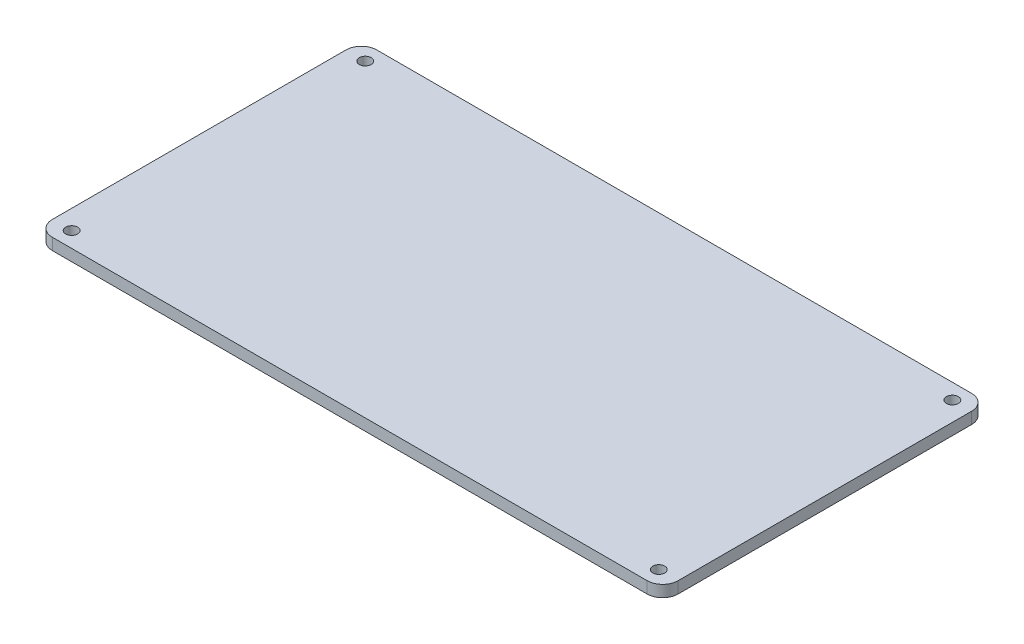
ISO-10303-21;
HEADER;
FILE_DESCRIPTION(('STEP AP214'),'2;1');
FILE_NAME('part.step','',(''),(''),'','','');
FILE_SCHEMA(('AUTOMOTIVE_DESIGN { 1 0 10303 214 1 1 1 1 }'));
ENDSEC;
DATA;
#1=APPLICATION_CONTEXT('core data for automotive mechanical design processes');
#2=APPLICATION_PROTOCOL_DEFINITION('international standard','automotive_design',2000,#1);
#3=PRODUCT_CONTEXT('',#1,'mechanical');
#4=PRODUCT('Part','Part','',(#3));
#5=PRODUCT_RELATED_PRODUCT_CATEGORY('part','',(#4));
#6=PRODUCT_DEFINITION_FORMATION('','',#4);
#7=PRODUCT_DEFINITION_CONTEXT('part definition',#1,'design');
#8=PRODUCT_DEFINITION('design','',#6,#7);
#9=PRODUCT_DEFINITION_SHAPE('','',#8);
#10=(LENGTH_UNIT() NAMED_UNIT(*) SI_UNIT(.MILLI.,.METRE.));
#11=(NAMED_UNIT(*) PLANE_ANGLE_UNIT() SI_UNIT($,.RADIAN.));
#12=(NAMED_UNIT(*) SI_UNIT($,.STERADIAN.) SOLID_ANGLE_UNIT());
#13=UNCERTAINTY_MEASURE_WITH_UNIT(LENGTH_MEASURE(1.E-05),#10,'distance_accuracy_value','');
#14=(GEOMETRIC_REPRESENTATION_CONTEXT(3) GLOBAL_UNCERTAINTY_ASSIGNED_CONTEXT((#13)) GLOBAL_UNIT_ASSIGNED_CONTEXT((#10,
#11,#12)) REPRESENTATION_CONTEXT('',''));
#15=CARTESIAN_POINT('',(0.,0.,0.));
#16=DIRECTION('',(0.,0.,1.));
#17=DIRECTION('',(1.,0.,0.));
#18=AXIS2_PLACEMENT_3D('',#15,#16,#17);
#19=CARTESIAN_POINT('',(-77.,3.,38.));
#20=DIRECTION('',(0.,-1.,0.));
#21=DIRECTION('',(0.,0.,-1.));
#22=AXIS2_PLACEMENT_3D('',#19,#20,#21);
#23=PLANE('',#22);
#24=CARTESIAN_POINT('',(-77.,3.,38.));
#25=DIRECTION('',(0.,1.,0.));
#26=DIRECTION('',(0.,0.,-1.));
#27=AXIS2_PLACEMENT_3D('',#24,#25,#26);
#28=CIRCLE('',#27,4.);
#29=CARTESIAN_POINT('',(-81.,3.,38.));
#30=VERTEX_POINT('',#29);
#31=CARTESIAN_POINT('',(-77.,3.,42.));
#32=VERTEX_POINT('',#31);
#33=EDGE_CURVE('E151',#30,#32,#28,.T.);
#34=ORIENTED_EDGE('',*,*,#33,.T.);
#35=DIRECTION('',(1.,0.,0.));
#36=VECTOR('',#35,1.);
#37=CARTESIAN_POINT('',(-77.,3.,42.));
#38=LINE('',#37,#36);
#39=CARTESIAN_POINT('',(77.,3.,42.));
#40=VERTEX_POINT('',#39);
#41=EDGE_CURVE('E99',#32,#40,#38,.T.);
#42=ORIENTED_EDGE('',*,*,#41,.T.);
#43=CARTESIAN_POINT('',(77.,3.,38.));
#44=DIRECTION('',(0.,1.,0.));
#45=DIRECTION('',(0.,0.,1.));
#46=AXIS2_PLACEMENT_3D('',#43,#44,#45);
#47=CIRCLE('',#46,4.);
#48=CARTESIAN_POINT('',(81.,3.,38.));
#49=VERTEX_POINT('',#48);
#50=EDGE_CURVE('E166',#40,#49,#47,.T.);
#51=ORIENTED_EDGE('',*,*,#50,.T.);
#52=DIRECTION('',(0.,0.,-1.));
#53=VECTOR('',#52,1.);
#54=CARTESIAN_POINT('',(81.,3.,38.));
#55=LINE('',#54,#53);
#56=CARTESIAN_POINT('',(81.,3.,-38.));
#57=VERTEX_POINT('',#56);
#58=EDGE_CURVE('E179',#49,#57,#55,.T.);
#59=ORIENTED_EDGE('',*,*,#58,.T.);
#60=CARTESIAN_POINT('',(77.,3.,-38.));
#61=DIRECTION('',(0.,1.,0.));
#62=DIRECTION('',(0.,0.,-1.));
#63=AXIS2_PLACEMENT_3D('',#60,#61,#62);
#64=CIRCLE('',#63,4.);
#65=CARTESIAN_POINT('',(77.,3.,-42.));
#66=VERTEX_POINT('',#65);
#67=EDGE_CURVE('E118',#57,#66,#64,.T.);
#68=ORIENTED_EDGE('',*,*,#67,.T.);
#69=DIRECTION('',(-1.,0.,0.));
#70=VECTOR('',#69,1.);
#71=CARTESIAN_POINT('',(-77.,3.,-42.));
#72=LINE('',#71,#70);
#73=CARTESIAN_POINT('',(-77.,3.,-42.));
#74=VERTEX_POINT('',#73);
#75=EDGE_CURVE('E112',#66,#74,#72,.T.);
#76=ORIENTED_EDGE('',*,*,#75,.T.);
#77=CARTESIAN_POINT('',(-77.,3.,-38.));
#78=DIRECTION('',(0.,1.,0.));
#79=DIRECTION('',(0.,0.,-1.));
#80=AXIS2_PLACEMENT_3D('',#77,#78,#79);
#81=CIRCLE('',#80,4.);
#82=CARTESIAN_POINT('',(-81.,3.,-38.));
#83=VERTEX_POINT('',#82);
#84=EDGE_CURVE('E116',#74,#83,#81,.T.);
#85=ORIENTED_EDGE('',*,*,#84,.T.);
#86=DIRECTION('',(0.,0.,1.));
#87=VECTOR('',#86,1.);
#88=CARTESIAN_POINT('',(-81.,3.,38.));
#89=LINE('',#88,#87);
#90=EDGE_CURVE('E56',#83,#30,#89,.T.);
#91=ORIENTED_EDGE('',*,*,#90,.T.);
#92=EDGE_LOOP('',(#34,#42,#51,#59,#68,#76,#85,#91));
#93=FACE_BOUND('',#92,.T.);
#94=CARTESIAN_POINT('',(-76.,3.,-38.));
#95=DIRECTION('',(0.,1.,0.));
#96=DIRECTION('',(0.,0.,1.));
#97=AXIS2_PLACEMENT_3D('',#94,#95,#96);
#98=CIRCLE('',#97,1.54999999999999);
#99=CARTESIAN_POINT('',(-76.,3.,-36.45));
#100=VERTEX_POINT('',#99);
#101=EDGE_CURVE('E140',#100,#100,#98,.T.);
#102=ORIENTED_EDGE('',*,*,#101,.F.);
#103=EDGE_LOOP('',(#102));
#104=FACE_BOUND('',#103,.T.);
#105=CARTESIAN_POINT('',(-76.,3.,38.));
#106=DIRECTION('',(0.,1.,0.));
#107=DIRECTION('',(0.,0.,-1.));
#108=AXIS2_PLACEMENT_3D('',#105,#106,#107);
#109=CIRCLE('',#108,1.54999999999999);
#110=CARTESIAN_POINT('',(-76.,3.,36.45));
#111=VERTEX_POINT('',#110);
#112=EDGE_CURVE('E188',#111,#111,#109,.T.);
#113=ORIENTED_EDGE('',*,*,#112,.F.);
#114=EDGE_LOOP('',(#113));
#115=FACE_BOUND('',#114,.T.);
#116=CARTESIAN_POINT('',(76.,3.,-38.));
#117=DIRECTION('',(0.,1.,0.));
#118=DIRECTION('',(0.,0.,-1.));
#119=AXIS2_PLACEMENT_3D('',#116,#117,#118);
#120=CIRCLE('',#119,1.54999999999999);
#121=CARTESIAN_POINT('',(76.,3.,-39.55));
#122=VERTEX_POINT('',#121);
#123=EDGE_CURVE('E194',#122,#122,#120,.T.);
#124=ORIENTED_EDGE('',*,*,#123,.F.);
#125=EDGE_LOOP('',(#124));
#126=FACE_BOUND('',#125,.T.);
#127=CARTESIAN_POINT('',(76.,3.,38.));
#128=DIRECTION('',(0.,1.,0.));
#129=DIRECTION('',(0.,0.,1.));
#130=AXIS2_PLACEMENT_3D('',#127,#128,#129);
#131=CIRCLE('',#130,1.54999999999999);
#132=CARTESIAN_POINT('',(76.,3.,39.55));
#133=VERTEX_POINT('',#132);
#134=EDGE_CURVE('E200',#133,#133,#131,.T.);
#135=ORIENTED_EDGE('',*,*,#134,.F.);
#136=EDGE_LOOP('',(#135));
#137=FACE_BOUND('',#136,.T.);
#138=ADVANCED_FACE('F39',(#93,#104,#115,#126,#137),#23,.F.);
#139=CARTESIAN_POINT('',(-77.,0.,38.));
#140=DIRECTION('',(0.,-1.,0.));
#141=DIRECTION('',(0.,0.,-1.));
#142=AXIS2_PLACEMENT_3D('',#139,#140,#141);
#143=PLANE('',#142);
#144=CARTESIAN_POINT('',(76.,0.,-38.));
#145=DIRECTION('',(0.,1.,0.));
#146=DIRECTION('',(0.,0.,-1.));
#147=AXIS2_PLACEMENT_3D('',#144,#145,#146);
#148=CIRCLE('',#147,1.54999999999999);
#149=CARTESIAN_POINT('',(76.,0.,-39.55));
#150=VERTEX_POINT('',#149);
#151=EDGE_CURVE('E197',#150,#150,#148,.T.);
#152=ORIENTED_EDGE('',*,*,#151,.T.);
#153=EDGE_LOOP('',(#152));
#154=FACE_BOUND('',#153,.T.);
#155=CARTESIAN_POINT('',(-76.,0.,-38.));
#156=DIRECTION('',(0.,1.,0.));
#157=DIRECTION('',(0.,0.,1.));
#158=AXIS2_PLACEMENT_3D('',#155,#156,#157);
#159=CIRCLE('',#158,1.54999999999999);
#160=CARTESIAN_POINT('',(-76.,0.,-36.45));
#161=VERTEX_POINT('',#160);
#162=EDGE_CURVE('E185',#161,#161,#159,.T.);
#163=ORIENTED_EDGE('',*,*,#162,.T.);
#164=EDGE_LOOP('',(#163));
#165=FACE_BOUND('',#164,.T.);
#166=CARTESIAN_POINT('',(-77.,0.,38.));
#167=DIRECTION('',(0.,1.,0.));
#168=DIRECTION('',(0.,0.,-1.));
#169=AXIS2_PLACEMENT_3D('',#166,#167,#168);
#170=CIRCLE('',#169,4.);
#171=CARTESIAN_POINT('',(-81.,0.,38.));
#172=VERTEX_POINT('',#171);
#173=CARTESIAN_POINT('',(-77.,0.,42.));
#174=VERTEX_POINT('',#173);
#175=EDGE_CURVE('E136',#172,#174,#170,.T.);
#176=ORIENTED_EDGE('',*,*,#175,.F.);
#177=DIRECTION('',(0.,0.,1.));
#178=VECTOR('',#177,1.);
#179=CARTESIAN_POINT('',(-81.,0.,38.));
#180=LINE('',#179,#178);
#181=CARTESIAN_POINT('',(-81.,0.,-38.));
#182=VERTEX_POINT('',#181);
#183=EDGE_CURVE('E91',#182,#172,#180,.T.);
#184=ORIENTED_EDGE('',*,*,#183,.F.);
#185=CARTESIAN_POINT('',(-77.,0.,-38.));
#186=DIRECTION('',(0.,1.,0.));
#187=DIRECTION('',(0.,0.,-1.));
#188=AXIS2_PLACEMENT_3D('',#185,#186,#187);
#189=CIRCLE('',#188,4.);
#190=CARTESIAN_POINT('',(-77.,0.,-42.));
#191=VERTEX_POINT('',#190);
#192=EDGE_CURVE('E85',#191,#182,#189,.T.);
#193=ORIENTED_EDGE('',*,*,#192,.F.);
#194=DIRECTION('',(-1.,0.,0.));
#195=VECTOR('',#194,1.);
#196=CARTESIAN_POINT('',(-77.,0.,-42.));
#197=LINE('',#196,#195);
#198=CARTESIAN_POINT('',(77.,0.,-42.));
#199=VERTEX_POINT('',#198);
#200=EDGE_CURVE('E126',#199,#191,#197,.T.);
#201=ORIENTED_EDGE('',*,*,#200,.F.);
#202=CARTESIAN_POINT('',(77.,0.,-38.));
#203=DIRECTION('',(0.,1.,0.));
#204=DIRECTION('',(0.,0.,-1.));
#205=AXIS2_PLACEMENT_3D('',#202,#203,#204);
#206=CIRCLE('',#205,4.);
#207=CARTESIAN_POINT('',(81.,0.,-38.));
#208=VERTEX_POINT('',#207);
#209=EDGE_CURVE('E146',#208,#199,#206,.T.);
#210=ORIENTED_EDGE('',*,*,#209,.F.);
#211=DIRECTION('',(0.,0.,-1.));
#212=VECTOR('',#211,1.);
#213=CARTESIAN_POINT('',(81.,0.,38.));
#214=LINE('',#213,#212);
#215=CARTESIAN_POINT('',(81.,0.,38.));
#216=VERTEX_POINT('',#215);
#217=EDGE_CURVE('E144',#216,#208,#214,.T.);
#218=ORIENTED_EDGE('',*,*,#217,.F.);
#219=CARTESIAN_POINT('',(77.,0.,38.));
#220=DIRECTION('',(0.,1.,0.));
#221=DIRECTION('',(0.,0.,1.));
#222=AXIS2_PLACEMENT_3D('',#219,#220,#221);
#223=CIRCLE('',#222,4.);
#224=CARTESIAN_POINT('',(77.,0.,42.));
#225=VERTEX_POINT('',#224);
#226=EDGE_CURVE('E142',#225,#216,#223,.T.);
#227=ORIENTED_EDGE('',*,*,#226,.F.);
#228=DIRECTION('',(1.,0.,0.));
#229=VECTOR('',#228,1.);
#230=CARTESIAN_POINT('',(-77.,0.,42.));
#231=LINE('',#230,#229);
#232=EDGE_CURVE('E139',#174,#225,#231,.T.);
#233=ORIENTED_EDGE('',*,*,#232,.F.);
#234=EDGE_LOOP('',(#176,#184,#193,#201,#210,#218,#227,#233));
#235=FACE_BOUND('',#234,.T.);
#236=CARTESIAN_POINT('',(-76.,0.,38.));
#237=DIRECTION('',(0.,1.,0.));
#238=DIRECTION('',(0.,0.,-1.));
#239=AXIS2_PLACEMENT_3D('',#236,#237,#238);
#240=CIRCLE('',#239,1.54999999999999);
#241=CARTESIAN_POINT('',(-76.,0.,36.45));
#242=VERTEX_POINT('',#241);
#243=EDGE_CURVE('E191',#242,#242,#240,.T.);
#244=ORIENTED_EDGE('',*,*,#243,.T.);
#245=EDGE_LOOP('',(#244));
#246=FACE_BOUND('',#245,.T.);
#247=CARTESIAN_POINT('',(76.,0.,38.));
#248=DIRECTION('',(0.,1.,0.));
#249=DIRECTION('',(0.,0.,1.));
#250=AXIS2_PLACEMENT_3D('',#247,#248,#249);
#251=CIRCLE('',#250,1.54999999999999);
#252=CARTESIAN_POINT('',(76.,0.,39.55));
#253=VERTEX_POINT('',#252);
#254=EDGE_CURVE('E203',#253,#253,#251,.T.);
#255=ORIENTED_EDGE('',*,*,#254,.T.);
#256=EDGE_LOOP('',(#255));
#257=FACE_BOUND('',#256,.T.);
#258=ADVANCED_FACE('F170',(#154,#165,#235,#246,#257),#143,.T.);
#259=CARTESIAN_POINT('',(-77.,3.,38.));
#260=DIRECTION('',(0.,-1.,0.));
#261=DIRECTION('',(0.,0.,-1.));
#262=AXIS2_PLACEMENT_3D('',#259,#260,#261);
#263=CYLINDRICAL_SURFACE('',#262,4.);
#264=ORIENTED_EDGE('',*,*,#175,.T.);
#265=DIRECTION('',(0.,-1.,0.));
#266=VECTOR('',#265,1.);
#267=CARTESIAN_POINT('',(-77.,3.,42.));
#268=LINE('',#267,#266);
#269=EDGE_CURVE('E11',#32,#174,#268,.T.);
#270=ORIENTED_EDGE('',*,*,#269,.F.);
#271=ORIENTED_EDGE('',*,*,#33,.F.);
#272=DIRECTION('',(0.,-1.,0.));
#273=VECTOR('',#272,1.);
#274=CARTESIAN_POINT('',(-81.,3.,38.));
#275=LINE('',#274,#273);
#276=EDGE_CURVE('E132',#30,#172,#275,.T.);
#277=ORIENTED_EDGE('',*,*,#276,.T.);
#278=EDGE_LOOP('',(#264,#270,#271,#277));
#279=FACE_BOUND('',#278,.T.);
#280=ADVANCED_FACE('F41',(#279),#263,.T.);
#281=CARTESIAN_POINT('',(-77.,3.,42.));
#282=DIRECTION('',(0.,0.,-1.));
#283=DIRECTION('',(-1.,0.,0.));
#284=AXIS2_PLACEMENT_3D('',#281,#282,#283);
#285=PLANE('',#284);
#286=ORIENTED_EDGE('',*,*,#232,.T.);
#287=DIRECTION('',(0.,-1.,0.));
#288=VECTOR('',#287,1.);
#289=CARTESIAN_POINT('',(77.,3.,42.));
#290=LINE('',#289,#288);
#291=EDGE_CURVE('E48',#40,#225,#290,.T.);
#292=ORIENTED_EDGE('',*,*,#291,.F.);
#293=ORIENTED_EDGE('',*,*,#41,.F.);
#294=ORIENTED_EDGE('',*,*,#269,.T.);
#295=EDGE_LOOP('',(#286,#292,#293,#294));
#296=FACE_BOUND('',#295,.T.);
#297=ADVANCED_FACE('F235',(#296),#285,.F.);
#298=CARTESIAN_POINT('',(77.,3.,38.));
#299=DIRECTION('',(0.,-1.,0.));
#300=DIRECTION('',(0.,0.,-1.));
#301=AXIS2_PLACEMENT_3D('',#298,#299,#300);
#302=CYLINDRICAL_SURFACE('',#301,4.);
#303=ORIENTED_EDGE('',*,*,#226,.T.);
#304=DIRECTION('',(0.,-1.,0.));
#305=VECTOR('',#304,1.);
#306=CARTESIAN_POINT('',(81.,3.,38.));
#307=LINE('',#306,#305);
#308=EDGE_CURVE('E158',#49,#216,#307,.T.);
#309=ORIENTED_EDGE('',*,*,#308,.F.);
#310=ORIENTED_EDGE('',*,*,#50,.F.);
#311=ORIENTED_EDGE('',*,*,#291,.T.);
#312=EDGE_LOOP('',(#303,#309,#310,#311));
#313=FACE_BOUND('',#312,.T.);
#314=ADVANCED_FACE('F164',(#313),#302,.T.);
#315=CARTESIAN_POINT('',(81.,3.,38.));
#316=DIRECTION('',(-1.,0.,0.));
#317=DIRECTION('',(0.,0.,1.));
#318=AXIS2_PLACEMENT_3D('',#315,#316,#317);
#319=PLANE('',#318);
#320=ORIENTED_EDGE('',*,*,#217,.T.);
#321=DIRECTION('',(0.,-1.,0.));
#322=VECTOR('',#321,1.);
#323=CARTESIAN_POINT('',(81.,3.,-38.));
#324=LINE('',#323,#322);
#325=EDGE_CURVE('E155',#57,#208,#324,.T.);
#326=ORIENTED_EDGE('',*,*,#325,.F.);
#327=ORIENTED_EDGE('',*,*,#58,.F.);
#328=ORIENTED_EDGE('',*,*,#308,.T.);
#329=EDGE_LOOP('',(#320,#326,#327,#328));
#330=FACE_BOUND('',#329,.T.);
#331=ADVANCED_FACE('F175',(#330),#319,.F.);
#332=CARTESIAN_POINT('',(77.,3.,-38.));
#333=DIRECTION('',(0.,-1.,0.));
#334=DIRECTION('',(0.,0.,-1.));
#335=AXIS2_PLACEMENT_3D('',#332,#333,#334);
#336=CYLINDRICAL_SURFACE('',#335,4.);
#337=ORIENTED_EDGE('',*,*,#209,.T.);
#338=DIRECTION('',(0.,-1.,0.));
#339=VECTOR('',#338,1.);
#340=CARTESIAN_POINT('',(77.,3.,-42.));
#341=LINE('',#340,#339);
#342=EDGE_CURVE('E127',#66,#199,#341,.T.);
#343=ORIENTED_EDGE('',*,*,#342,.F.);
#344=ORIENTED_EDGE('',*,*,#67,.F.);
#345=ORIENTED_EDGE('',*,*,#325,.T.);
#346=EDGE_LOOP('',(#337,#343,#344,#345));
#347=FACE_BOUND('',#346,.T.);
#348=ADVANCED_FACE('F178',(#347),#336,.T.);
#349=CARTESIAN_POINT('',(-77.,3.,-42.));
#350=DIRECTION('',(0.,0.,1.));
#351=DIRECTION('',(1.,0.,0.));
#352=AXIS2_PLACEMENT_3D('',#349,#350,#351);
#353=PLANE('',#352);
#354=ORIENTED_EDGE('',*,*,#200,.T.);
#355=DIRECTION('',(0.,-1.,0.));
#356=VECTOR('',#355,1.);
#357=CARTESIAN_POINT('',(-77.,3.,-42.));
#358=LINE('',#357,#356);
#359=EDGE_CURVE('E123',#74,#191,#358,.T.);
#360=ORIENTED_EDGE('',*,*,#359,.F.);
#361=ORIENTED_EDGE('',*,*,#75,.F.);
#362=ORIENTED_EDGE('',*,*,#342,.T.);
#363=EDGE_LOOP('',(#354,#360,#361,#362));
#364=FACE_BOUND('',#363,.T.);
#365=ADVANCED_FACE('F124',(#364),#353,.F.);
#366=CARTESIAN_POINT('',(-77.,3.,-38.));
#367=DIRECTION('',(0.,-1.,0.));
#368=DIRECTION('',(0.,0.,-1.));
#369=AXIS2_PLACEMENT_3D('',#366,#367,#368);
#370=CYLINDRICAL_SURFACE('',#369,4.);
#371=ORIENTED_EDGE('',*,*,#192,.T.);
#372=DIRECTION('',(0.,-1.,0.));
#373=VECTOR('',#372,1.);
#374=CARTESIAN_POINT('',(-81.,3.,-38.));
#375=LINE('',#374,#373);
#376=EDGE_CURVE('E128',#83,#182,#375,.T.);
#377=ORIENTED_EDGE('',*,*,#376,.F.);
#378=ORIENTED_EDGE('',*,*,#84,.F.);
#379=ORIENTED_EDGE('',*,*,#359,.T.);
#380=EDGE_LOOP('',(#371,#377,#378,#379));
#381=FACE_BOUND('',#380,.T.);
#382=ADVANCED_FACE('F130',(#381),#370,.T.);
#383=CARTESIAN_POINT('',(-81.,3.,38.));
#384=DIRECTION('',(1.,0.,0.));
#385=DIRECTION('',(0.,0.,-1.));
#386=AXIS2_PLACEMENT_3D('',#383,#384,#385);
#387=PLANE('',#386);
#388=ORIENTED_EDGE('',*,*,#183,.T.);
#389=ORIENTED_EDGE('',*,*,#276,.F.);
#390=ORIENTED_EDGE('',*,*,#90,.F.);
#391=ORIENTED_EDGE('',*,*,#376,.T.);
#392=EDGE_LOOP('',(#388,#389,#390,#391));
#393=FACE_BOUND('',#392,.T.);
#394=ADVANCED_FACE('F223',(#393),#387,.F.);
#395=CARTESIAN_POINT('',(-76.,3.,-38.));
#396=DIRECTION('',(0.,-1.,0.));
#397=DIRECTION('',(0.,0.,-1.));
#398=AXIS2_PLACEMENT_3D('',#395,#396,#397);
#399=CYLINDRICAL_SURFACE('',#398,1.54999999999999);
#400=ORIENTED_EDGE('',*,*,#101,.T.);
#401=EDGE_LOOP('',(#400));
#402=FACE_BOUND('',#401,.T.);
#403=ORIENTED_EDGE('',*,*,#162,.F.);
#404=EDGE_LOOP('',(#403));
#405=FACE_BOUND('',#404,.T.);
#406=ADVANCED_FACE('F220',(#402,#405),#399,.F.);
#407=CARTESIAN_POINT('',(-76.,3.,38.));
#408=DIRECTION('',(0.,-1.,0.));
#409=DIRECTION('',(0.,0.,-1.));
#410=AXIS2_PLACEMENT_3D('',#407,#408,#409);
#411=CYLINDRICAL_SURFACE('',#410,1.54999999999999);
#412=ORIENTED_EDGE('',*,*,#112,.T.);
#413=EDGE_LOOP('',(#412));
#414=FACE_BOUND('',#413,.T.);
#415=ORIENTED_EDGE('',*,*,#243,.F.);
#416=EDGE_LOOP('',(#415));
#417=FACE_BOUND('',#416,.T.);
#418=ADVANCED_FACE('F299',(#414,#417),#411,.F.);
#419=CARTESIAN_POINT('',(76.,3.,-38.));
#420=DIRECTION('',(0.,-1.,0.));
#421=DIRECTION('',(0.,0.,-1.));
#422=AXIS2_PLACEMENT_3D('',#419,#420,#421);
#423=CYLINDRICAL_SURFACE('',#422,1.54999999999999);
#424=ORIENTED_EDGE('',*,*,#123,.T.);
#425=EDGE_LOOP('',(#424));
#426=FACE_BOUND('',#425,.T.);
#427=ORIENTED_EDGE('',*,*,#151,.F.);
#428=EDGE_LOOP('',(#427));
#429=FACE_BOUND('',#428,.T.);
#430=ADVANCED_FACE('F307',(#426,#429),#423,.F.);
#431=CARTESIAN_POINT('',(76.,3.,38.));
#432=DIRECTION('',(0.,-1.,0.));
#433=DIRECTION('',(0.,0.,-1.));
#434=AXIS2_PLACEMENT_3D('',#431,#432,#433);
#435=CYLINDRICAL_SURFACE('',#434,1.54999999999999);
#436=ORIENTED_EDGE('',*,*,#134,.T.);
#437=EDGE_LOOP('',(#436));
#438=FACE_BOUND('',#437,.T.);
#439=ORIENTED_EDGE('',*,*,#254,.F.);
#440=EDGE_LOOP('',(#439));
#441=FACE_BOUND('',#440,.T.);
#442=ADVANCED_FACE('F209',(#438,#441),#435,.F.);
#443=CLOSED_SHELL('',(#138,#258,#280,#297,#314,#331,#348,#365,#382,#394,#406,#418,#430,#442));
#444=MANIFOLD_SOLID_BREP('B2',#443);
#445=ADVANCED_BREP_SHAPE_REPRESENTATION('',(#18,#444),#14);
#446=SHAPE_DEFINITION_REPRESENTATION(#9,#445);
ENDSEC;
END-ISO-10303-21;
